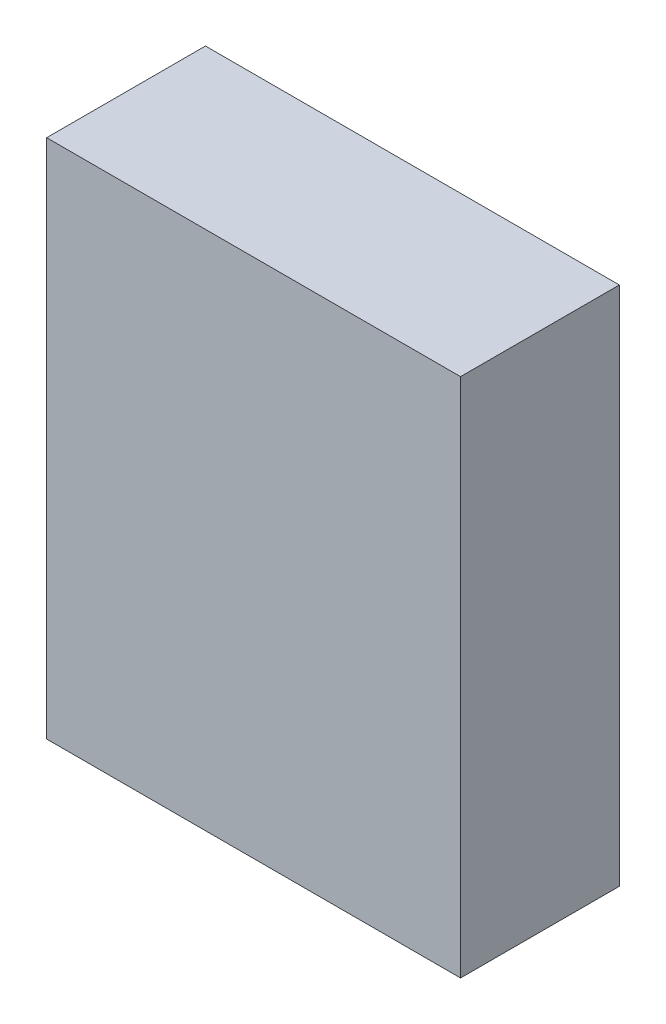
ISO-10303-21;
HEADER;
FILE_DESCRIPTION(('STEP AP214'),'2;1');
FILE_NAME('part.step','',(''),(''),'','','');
FILE_SCHEMA(('AUTOMOTIVE_DESIGN { 1 0 10303 214 1 1 1 1 }'));
ENDSEC;
DATA;
#1=APPLICATION_CONTEXT('core data for automotive mechanical design processes');
#2=APPLICATION_PROTOCOL_DEFINITION('international standard','automotive_design',2000,#1);
#3=PRODUCT_CONTEXT('',#1,'mechanical');
#4=PRODUCT('Part','Part','',(#3));
#5=PRODUCT_RELATED_PRODUCT_CATEGORY('part','',(#4));
#6=PRODUCT_DEFINITION_FORMATION('','',#4);
#7=PRODUCT_DEFINITION_CONTEXT('part definition',#1,'design');
#8=PRODUCT_DEFINITION('design','',#6,#7);
#9=PRODUCT_DEFINITION_SHAPE('','',#8);
#10=(LENGTH_UNIT() NAMED_UNIT(*) SI_UNIT(.MILLI.,.METRE.));
#11=(NAMED_UNIT(*) PLANE_ANGLE_UNIT() SI_UNIT($,.RADIAN.));
#12=(NAMED_UNIT(*) SI_UNIT($,.STERADIAN.) SOLID_ANGLE_UNIT());
#13=UNCERTAINTY_MEASURE_WITH_UNIT(LENGTH_MEASURE(1.E-05),#10,'distance_accuracy_value','');
#14=(GEOMETRIC_REPRESENTATION_CONTEXT(3) GLOBAL_UNCERTAINTY_ASSIGNED_CONTEXT((#13)) GLOBAL_UNIT_ASSIGNED_CONTEXT((#10,
#11,#12)) REPRESENTATION_CONTEXT('',''));
#15=CARTESIAN_POINT('',(0.,0.,0.));
#16=DIRECTION('',(0.,0.,1.));
#17=DIRECTION('',(1.,0.,0.));
#18=AXIS2_PLACEMENT_3D('',#15,#16,#17);
#19=CARTESIAN_POINT('',(-0.99299268,1.24949204,0.762));
#20=DIRECTION('',(0.,0.,1.));
#21=DIRECTION('',(1.,0.,0.));
#22=AXIS2_PLACEMENT_3D('',#19,#20,#21);
#23=PLANE('',#22);
#24=DIRECTION('',(0.,1.,0.));
#25=VECTOR('',#24,1.);
#26=CARTESIAN_POINT('',(0.99299268,1.24949204,0.762));
#27=LINE('',#26,#25);
#28=CARTESIAN_POINT('',(0.99299268,1.24949204,0.762));
#29=VERTEX_POINT('',#28);
#30=CARTESIAN_POINT('',(0.99299268,-1.24949204,0.762));
#31=VERTEX_POINT('',#30);
#32=EDGE_CURVE('E53',#29,#31,#27,.F.);
#33=ORIENTED_EDGE('',*,*,#32,.F.);
#34=DIRECTION('',(1.,0.,0.));
#35=VECTOR('',#34,1.);
#36=CARTESIAN_POINT('',(-0.99299268,1.24949204,0.762));
#37=LINE('',#36,#35);
#38=CARTESIAN_POINT('',(-0.99299268,1.24949204,0.762));
#39=VERTEX_POINT('',#38);
#40=EDGE_CURVE('E68',#39,#29,#37,.T.);
#41=ORIENTED_EDGE('',*,*,#40,.F.);
#42=DIRECTION('',(0.,1.,0.));
#43=VECTOR('',#42,1.);
#44=CARTESIAN_POINT('',(-0.99299268,-1.24949204,0.762));
#45=LINE('',#44,#43);
#46=CARTESIAN_POINT('',(-0.99299268,-1.24949204,0.762));
#47=VERTEX_POINT('',#46);
#48=EDGE_CURVE('E20',#47,#39,#45,.T.);
#49=ORIENTED_EDGE('',*,*,#48,.F.);
#50=DIRECTION('',(1.,0.,0.));
#51=VECTOR('',#50,1.);
#52=CARTESIAN_POINT('',(0.99299268,-1.24949204,0.762));
#53=LINE('',#52,#51);
#54=EDGE_CURVE('E58',#31,#47,#53,.F.);
#55=ORIENTED_EDGE('',*,*,#54,.F.);
#56=EDGE_LOOP('',(#33,#41,#49,#55));
#57=FACE_BOUND('',#56,.T.);
#58=ADVANCED_FACE('F17',(#57),#23,.T.);
#59=CARTESIAN_POINT('',(-0.99299268,-1.24949204,0.));
#60=DIRECTION('',(-1.,0.,0.));
#61=DIRECTION('',(0.,0.,1.));
#62=AXIS2_PLACEMENT_3D('',#59,#60,#61);
#63=PLANE('',#62);
#64=DIRECTION('',(0.,0.,1.));
#65=VECTOR('',#64,1.);
#66=CARTESIAN_POINT('',(-0.99299268,1.24949204,0.));
#67=LINE('',#66,#65);
#68=CARTESIAN_POINT('',(-0.99299268,1.24949204,0.));
#69=VERTEX_POINT('',#68);
#70=EDGE_CURVE('E79',#69,#39,#67,.T.);
#71=ORIENTED_EDGE('',*,*,#70,.F.);
#72=DIRECTION('',(0.,1.,0.));
#73=VECTOR('',#72,1.);
#74=CARTESIAN_POINT('',(-0.99299268,1.24949204,0.));
#75=LINE('',#74,#73);
#76=CARTESIAN_POINT('',(-0.99299268,-1.24949204,0.));
#77=VERTEX_POINT('',#76);
#78=EDGE_CURVE('E74',#69,#77,#75,.F.);
#79=ORIENTED_EDGE('',*,*,#78,.T.);
#80=DIRECTION('',(0.,0.,-1.));
#81=VECTOR('',#80,1.);
#82=CARTESIAN_POINT('',(-0.99299268,-1.24949204,0.));
#83=LINE('',#82,#81);
#84=EDGE_CURVE('E63',#47,#77,#83,.T.);
#85=ORIENTED_EDGE('',*,*,#84,.F.);
#86=ORIENTED_EDGE('',*,*,#48,.T.);
#87=EDGE_LOOP('',(#71,#79,#85,#86));
#88=FACE_BOUND('',#87,.T.);
#89=ADVANCED_FACE('F73',(#88),#63,.T.);
#90=CARTESIAN_POINT('',(0.99299268,-1.24949204,0.));
#91=DIRECTION('',(0.,-1.,0.));
#92=DIRECTION('',(0.,0.,-1.));
#93=AXIS2_PLACEMENT_3D('',#90,#91,#92);
#94=PLANE('',#93);
#95=ORIENTED_EDGE('',*,*,#84,.T.);
#96=DIRECTION('',(1.,0.,0.));
#97=VECTOR('',#96,1.);
#98=CARTESIAN_POINT('',(-0.99299268,-1.24949204,0.));
#99=LINE('',#98,#97);
#100=CARTESIAN_POINT('',(0.99299268,-1.24949204,0.));
#101=VERTEX_POINT('',#100);
#102=EDGE_CURVE('E84',#77,#101,#99,.T.);
#103=ORIENTED_EDGE('',*,*,#102,.T.);
#104=DIRECTION('',(0.,0.,-1.));
#105=VECTOR('',#104,1.);
#106=CARTESIAN_POINT('',(0.99299268,-1.24949204,0.));
#107=LINE('',#106,#105);
#108=EDGE_CURVE('E65',#31,#101,#107,.T.);
#109=ORIENTED_EDGE('',*,*,#108,.F.);
#110=ORIENTED_EDGE('',*,*,#54,.T.);
#111=EDGE_LOOP('',(#95,#103,#109,#110));
#112=FACE_BOUND('',#111,.T.);
#113=ADVANCED_FACE('F60',(#112),#94,.T.);
#114=CARTESIAN_POINT('',(0.99299268,1.24949204,0.));
#115=DIRECTION('',(1.,0.,0.));
#116=DIRECTION('',(0.,0.,-1.));
#117=AXIS2_PLACEMENT_3D('',#114,#115,#116);
#118=PLANE('',#117);
#119=ORIENTED_EDGE('',*,*,#108,.T.);
#120=DIRECTION('',(0.,1.,0.));
#121=VECTOR('',#120,1.);
#122=CARTESIAN_POINT('',(0.99299268,1.24949204,0.));
#123=LINE('',#122,#121);
#124=CARTESIAN_POINT('',(0.99299268,1.24949204,0.));
#125=VERTEX_POINT('',#124);
#126=EDGE_CURVE('E26',#101,#125,#123,.T.);
#127=ORIENTED_EDGE('',*,*,#126,.T.);
#128=DIRECTION('',(0.,0.,1.));
#129=VECTOR('',#128,1.);
#130=CARTESIAN_POINT('',(0.99299268,1.24949204,0.));
#131=LINE('',#130,#129);
#132=EDGE_CURVE('E34',#29,#125,#131,.F.);
#133=ORIENTED_EDGE('',*,*,#132,.F.);
#134=ORIENTED_EDGE('',*,*,#32,.T.);
#135=EDGE_LOOP('',(#119,#127,#133,#134));
#136=FACE_BOUND('',#135,.T.);
#137=ADVANCED_FACE('F88',(#136),#118,.T.);
#138=CARTESIAN_POINT('',(-0.99299268,1.24949204,0.));
#139=DIRECTION('',(0.,1.,0.));
#140=DIRECTION('',(0.,0.,1.));
#141=AXIS2_PLACEMENT_3D('',#138,#139,#140);
#142=PLANE('',#141);
#143=ORIENTED_EDGE('',*,*,#132,.T.);
#144=DIRECTION('',(1.,0.,0.));
#145=VECTOR('',#144,1.);
#146=CARTESIAN_POINT('',(-0.99299268,1.24949204,0.));
#147=LINE('',#146,#145);
#148=EDGE_CURVE('E11',#125,#69,#147,.F.);
#149=ORIENTED_EDGE('',*,*,#148,.T.);
#150=ORIENTED_EDGE('',*,*,#70,.T.);
#151=ORIENTED_EDGE('',*,*,#40,.T.);
#152=EDGE_LOOP('',(#143,#149,#150,#151));
#153=FACE_BOUND('',#152,.T.);
#154=ADVANCED_FACE('F91',(#153),#142,.T.);
#155=CARTESIAN_POINT('',(-0.99299268,1.24949204,0.));
#156=DIRECTION('',(0.,0.,1.));
#157=DIRECTION('',(1.,0.,0.));
#158=AXIS2_PLACEMENT_3D('',#155,#156,#157);
#159=PLANE('',#158);
#160=ORIENTED_EDGE('',*,*,#126,.F.);
#161=ORIENTED_EDGE('',*,*,#102,.F.);
#162=ORIENTED_EDGE('',*,*,#78,.F.);
#163=ORIENTED_EDGE('',*,*,#148,.F.);
#164=EDGE_LOOP('',(#160,#161,#162,#163));
#165=FACE_BOUND('',#164,.T.);
#166=ADVANCED_FACE('F90',(#165),#159,.F.);
#167=CLOSED_SHELL('',(#58,#89,#113,#137,#154,#166));
#168=MANIFOLD_SOLID_BREP('B1',#167);
#169=ADVANCED_BREP_SHAPE_REPRESENTATION('',(#18,#168),#14);
#170=SHAPE_DEFINITION_REPRESENTATION(#9,#169);
ENDSEC;
END-ISO-10303-21;
